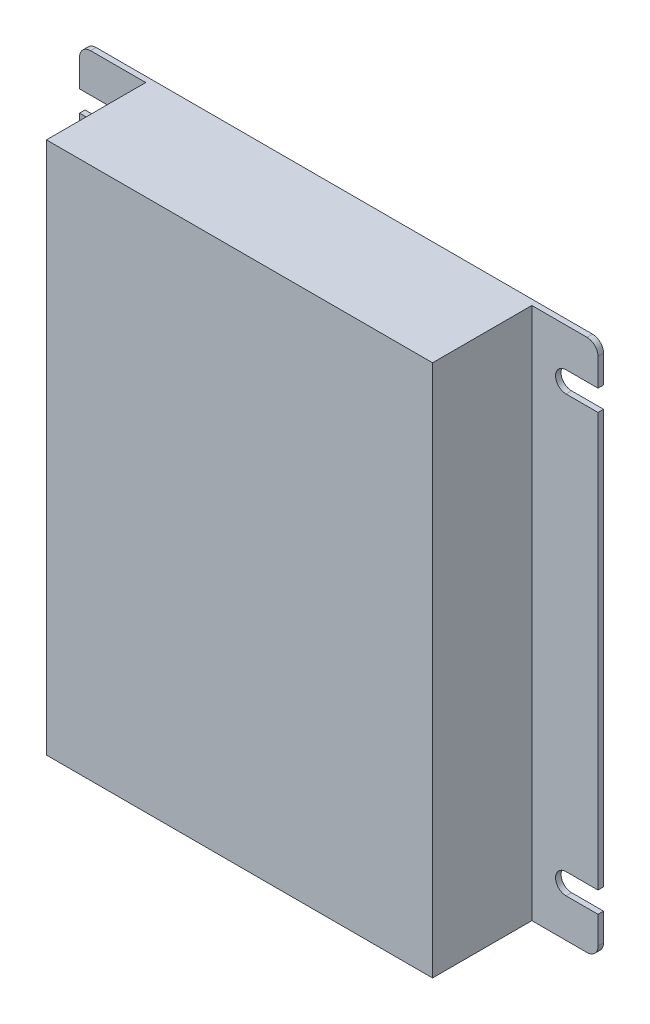
ISO-10303-21;
HEADER;
FILE_DESCRIPTION(('STEP AP214'),'2;1');
FILE_NAME('part.step','',(''),(''),'','','');
FILE_SCHEMA(('AUTOMOTIVE_DESIGN { 1 0 10303 214 1 1 1 1 }'));
ENDSEC;
DATA;
#1=APPLICATION_CONTEXT('core data for automotive mechanical design processes');
#2=APPLICATION_PROTOCOL_DEFINITION('international standard','automotive_design',2000,#1);
#3=PRODUCT_CONTEXT('',#1,'mechanical');
#4=PRODUCT('Part','Part','',(#3));
#5=PRODUCT_RELATED_PRODUCT_CATEGORY('part','',(#4));
#6=PRODUCT_DEFINITION_FORMATION('','',#4);
#7=PRODUCT_DEFINITION_CONTEXT('part definition',#1,'design');
#8=PRODUCT_DEFINITION('design','',#6,#7);
#9=PRODUCT_DEFINITION_SHAPE('','',#8);
#10=(LENGTH_UNIT() NAMED_UNIT(*) SI_UNIT(.MILLI.,.METRE.));
#11=(NAMED_UNIT(*) PLANE_ANGLE_UNIT() SI_UNIT($,.RADIAN.));
#12=(NAMED_UNIT(*) SI_UNIT($,.STERADIAN.) SOLID_ANGLE_UNIT());
#13=UNCERTAINTY_MEASURE_WITH_UNIT(LENGTH_MEASURE(1.E-05),#10,'distance_accuracy_value','');
#14=(GEOMETRIC_REPRESENTATION_CONTEXT(3) GLOBAL_UNCERTAINTY_ASSIGNED_CONTEXT((#13)) GLOBAL_UNIT_ASSIGNED_CONTEXT((#10,
#11,#12)) REPRESENTATION_CONTEXT('',''));
#15=CARTESIAN_POINT('',(0.,0.,0.));
#16=DIRECTION('',(0.,0.,1.));
#17=DIRECTION('',(1.,0.,0.));
#18=AXIS2_PLACEMENT_3D('',#15,#16,#17);
#19=CARTESIAN_POINT('',(59.69,61.341,24.13));
#20=DIRECTION('',(-1.,0.,0.));
#21=DIRECTION('',(0.,-1.,0.));
#22=AXIS2_PLACEMENT_3D('',#19,#20,#21);
#23=PLANE('',#22);
#24=DIRECTION('',(0.,1.,0.));
#25=VECTOR('',#24,1.);
#26=CARTESIAN_POINT('',(59.69,61.341,0.));
#27=LINE('',#26,#25);
#28=CARTESIAN_POINT('',(59.69,-47.625,0.));
#29=VERTEX_POINT('',#28);
#30=CARTESIAN_POINT('',(59.69,47.625,0.));
#31=VERTEX_POINT('',#30);
#32=EDGE_CURVE('E321',#29,#31,#27,.T.);
#33=ORIENTED_EDGE('',*,*,#32,.T.);
#34=DIRECTION('',(0.,0.,1.));
#35=VECTOR('',#34,1.);
#36=CARTESIAN_POINT('',(59.69,47.625,0.));
#37=LINE('',#36,#35);
#38=CARTESIAN_POINT('',(59.69,47.625,1.26999999999999));
#39=VERTEX_POINT('',#38);
#40=EDGE_CURVE('E361',#31,#39,#37,.T.);
#41=ORIENTED_EDGE('',*,*,#40,.T.);
#42=DIRECTION('',(0.,-1.,0.));
#43=VECTOR('',#42,1.);
#44=CARTESIAN_POINT('',(59.69,61.341,1.27));
#45=LINE('',#44,#43);
#46=CARTESIAN_POINT('',(59.69,-47.625,1.27));
#47=VERTEX_POINT('',#46);
#48=EDGE_CURVE('E324',#39,#47,#45,.T.);
#49=ORIENTED_EDGE('',*,*,#48,.T.);
#50=DIRECTION('',(0.,0.,1.));
#51=VECTOR('',#50,1.);
#52=CARTESIAN_POINT('',(59.69,-47.625,0.));
#53=LINE('',#52,#51);
#54=EDGE_CURVE('E349',#29,#47,#53,.T.);
#55=ORIENTED_EDGE('',*,*,#54,.F.);
#56=EDGE_LOOP('',(#33,#41,#49,#55));
#57=FACE_BOUND('',#56,.T.);
#58=ADVANCED_FACE('F34',(#57),#23,.F.);
#59=CARTESIAN_POINT('',(59.69,-52.451,1.26999999999999));
#60=VERTEX_POINT('',#59);
#61=CARTESIAN_POINT('',(59.69,-58.801,1.27));
#62=VERTEX_POINT('',#61);
#63=EDGE_CURVE('E326',#60,#62,#45,.T.);
#64=ORIENTED_EDGE('',*,*,#63,.T.);
#65=DIRECTION('',(0.,0.,-1.));
#66=VECTOR('',#65,1.);
#67=CARTESIAN_POINT('',(59.69,-58.801,24.13));
#68=LINE('',#67,#66);
#69=CARTESIAN_POINT('',(59.69,-58.801,0.));
#70=VERTEX_POINT('',#69);
#71=EDGE_CURVE('E293',#62,#70,#68,.T.);
#72=ORIENTED_EDGE('',*,*,#71,.T.);
#73=CARTESIAN_POINT('',(59.69,-52.451,0.));
#74=VERTEX_POINT('',#73);
#75=EDGE_CURVE('E252',#70,#74,#27,.T.);
#76=ORIENTED_EDGE('',*,*,#75,.T.);
#77=DIRECTION('',(0.,0.,1.));
#78=VECTOR('',#77,1.);
#79=CARTESIAN_POINT('',(59.69,-52.451,0.));
#80=LINE('',#79,#78);
#81=EDGE_CURVE('E333',#74,#60,#80,.T.);
#82=ORIENTED_EDGE('',*,*,#81,.T.);
#83=EDGE_LOOP('',(#64,#72,#76,#82));
#84=FACE_BOUND('',#83,.T.);
#85=ADVANCED_FACE('F332',(#84),#23,.F.);
#86=CARTESIAN_POINT('',(-59.69,61.341,24.13));
#87=DIRECTION('',(1.,0.,0.));
#88=DIRECTION('',(0.,1.,0.));
#89=AXIS2_PLACEMENT_3D('',#86,#87,#88);
#90=PLANE('',#89);
#91=DIRECTION('',(0.,-1.,0.));
#92=VECTOR('',#91,1.);
#93=CARTESIAN_POINT('',(-59.69,61.341,0.));
#94=LINE('',#93,#92);
#95=CARTESIAN_POINT('',(-59.69,47.625,0.));
#96=VERTEX_POINT('',#95);
#97=CARTESIAN_POINT('',(-59.69,-47.625,0.));
#98=VERTEX_POINT('',#97);
#99=EDGE_CURVE('E246',#96,#98,#94,.T.);
#100=ORIENTED_EDGE('',*,*,#99,.T.);
#101=DIRECTION('',(0.,0.,1.));
#102=VECTOR('',#101,1.);
#103=CARTESIAN_POINT('',(-59.69,-47.625,0.));
#104=LINE('',#103,#102);
#105=CARTESIAN_POINT('',(-59.69,-47.625,1.26999999999999));
#106=VERTEX_POINT('',#105);
#107=EDGE_CURVE('E405',#98,#106,#104,.T.);
#108=ORIENTED_EDGE('',*,*,#107,.T.);
#109=DIRECTION('',(0.,-1.,0.));
#110=VECTOR('',#109,1.);
#111=CARTESIAN_POINT('',(-59.69,61.341,1.26999999999999));
#112=LINE('',#111,#110);
#113=CARTESIAN_POINT('',(-59.69,47.625,1.26999999999999));
#114=VERTEX_POINT('',#113);
#115=EDGE_CURVE('E442',#114,#106,#112,.T.);
#116=ORIENTED_EDGE('',*,*,#115,.F.);
#117=DIRECTION('',(0.,0.,1.));
#118=VECTOR('',#117,1.);
#119=CARTESIAN_POINT('',(-59.69,47.625,0.));
#120=LINE('',#119,#118);
#121=EDGE_CURVE('E400',#96,#114,#120,.T.);
#122=ORIENTED_EDGE('',*,*,#121,.F.);
#123=EDGE_LOOP('',(#100,#108,#116,#122));
#124=FACE_BOUND('',#123,.T.);
#125=ADVANCED_FACE('F472',(#124),#90,.F.);
#126=CARTESIAN_POINT('',(-59.69,58.801,1.26999999999999));
#127=VERTEX_POINT('',#126);
#128=CARTESIAN_POINT('',(-59.69,52.451,1.26999999999999));
#129=VERTEX_POINT('',#128);
#130=EDGE_CURVE('E441',#127,#129,#112,.T.);
#131=ORIENTED_EDGE('',*,*,#130,.F.);
#132=DIRECTION('',(0.,0.,-1.));
#133=VECTOR('',#132,1.);
#134=CARTESIAN_POINT('',(-59.69,58.801,24.13));
#135=LINE('',#134,#133);
#136=CARTESIAN_POINT('',(-59.69,58.801,0.));
#137=VERTEX_POINT('',#136);
#138=EDGE_CURVE('E269',#127,#137,#135,.T.);
#139=ORIENTED_EDGE('',*,*,#138,.T.);
#140=CARTESIAN_POINT('',(-59.69,52.451,0.));
#141=VERTEX_POINT('',#140);
#142=EDGE_CURVE('E249',#137,#141,#94,.T.);
#143=ORIENTED_EDGE('',*,*,#142,.T.);
#144=DIRECTION('',(0.,0.,1.));
#145=VECTOR('',#144,1.);
#146=CARTESIAN_POINT('',(-59.69,52.451,0.));
#147=LINE('',#146,#145);
#148=EDGE_CURVE('E410',#141,#129,#147,.T.);
#149=ORIENTED_EDGE('',*,*,#148,.T.);
#150=EDGE_LOOP('',(#131,#139,#143,#149));
#151=FACE_BOUND('',#150,.T.);
#152=ADVANCED_FACE('F476',(#151),#90,.F.);
#153=CARTESIAN_POINT('',(59.69,52.451,0.));
#154=VERTEX_POINT('',#153);
#155=CARTESIAN_POINT('',(59.69,58.801,0.));
#156=VERTEX_POINT('',#155);
#157=EDGE_CURVE('E316',#154,#156,#27,.T.);
#158=ORIENTED_EDGE('',*,*,#157,.T.);
#159=DIRECTION('',(0.,0.,-1.));
#160=VECTOR('',#159,1.);
#161=CARTESIAN_POINT('',(59.69,58.801,24.13));
#162=LINE('',#161,#160);
#163=CARTESIAN_POINT('',(59.69,58.801,1.27));
#164=VERTEX_POINT('',#163);
#165=EDGE_CURVE('E11',#156,#164,#162,.F.);
#166=ORIENTED_EDGE('',*,*,#165,.T.);
#167=CARTESIAN_POINT('',(59.69,52.451,1.27));
#168=VERTEX_POINT('',#167);
#169=EDGE_CURVE('E304',#164,#168,#45,.T.);
#170=ORIENTED_EDGE('',*,*,#169,.T.);
#171=DIRECTION('',(0.,0.,1.));
#172=VECTOR('',#171,1.);
#173=CARTESIAN_POINT('',(59.69,52.451,0.));
#174=LINE('',#173,#172);
#175=EDGE_CURVE('E320',#154,#168,#174,.T.);
#176=ORIENTED_EDGE('',*,*,#175,.F.);
#177=EDGE_LOOP('',(#158,#166,#170,#176));
#178=FACE_BOUND('',#177,.T.);
#179=ADVANCED_FACE('F318',(#178),#23,.F.);
#180=CARTESIAN_POINT('',(-59.69,61.341,24.13));
#181=DIRECTION('',(0.,-1.,0.));
#182=DIRECTION('',(0.,0.,-1.));
#183=AXIS2_PLACEMENT_3D('',#180,#181,#182);
#184=PLANE('',#183);
#185=DIRECTION('',(-1.,0.,0.));
#186=VECTOR('',#185,1.);
#187=CARTESIAN_POINT('',(-59.69,61.341,0.));
#188=LINE('',#187,#186);
#189=CARTESIAN_POINT('',(57.15,61.341,0.));
#190=VERTEX_POINT('',#189);
#191=CARTESIAN_POINT('',(-57.15,61.341,0.));
#192=VERTEX_POINT('',#191);
#193=EDGE_CURVE('E247',#190,#192,#188,.T.);
#194=ORIENTED_EDGE('',*,*,#193,.T.);
#195=DIRECTION('',(0.,0.,-1.));
#196=VECTOR('',#195,1.);
#197=CARTESIAN_POINT('',(-57.15,61.341,24.13));
#198=LINE('',#197,#196);
#199=CARTESIAN_POINT('',(-57.15,61.341,1.26999999999999));
#200=VERTEX_POINT('',#199);
#201=EDGE_CURVE('E281',#192,#200,#198,.F.);
#202=ORIENTED_EDGE('',*,*,#201,.T.);
#203=DIRECTION('',(1.,0.,0.));
#204=VECTOR('',#203,1.);
#205=CARTESIAN_POINT('',(-59.69,61.341,1.26999999999999));
#206=LINE('',#205,#204);
#207=CARTESIAN_POINT('',(-44.45,61.341,1.26999999999999));
#208=VERTEX_POINT('',#207);
#209=EDGE_CURVE('E428',#200,#208,#206,.T.);
#210=ORIENTED_EDGE('',*,*,#209,.T.);
#211=DIRECTION('',(0.,0.,1.));
#212=VECTOR('',#211,1.);
#213=CARTESIAN_POINT('',(-44.45,61.341,24.13));
#214=LINE('',#213,#212);
#215=CARTESIAN_POINT('',(-44.45,61.341,24.13));
#216=VERTEX_POINT('',#215);
#217=EDGE_CURVE('E430',#208,#216,#214,.T.);
#218=ORIENTED_EDGE('',*,*,#217,.T.);
#219=DIRECTION('',(-1.,0.,0.));
#220=VECTOR('',#219,1.);
#221=CARTESIAN_POINT('',(-59.69,61.341,24.13));
#222=LINE('',#221,#220);
#223=CARTESIAN_POINT('',(44.45,61.341,24.13));
#224=VERTEX_POINT('',#223);
#225=EDGE_CURVE('E261',#224,#216,#222,.T.);
#226=ORIENTED_EDGE('',*,*,#225,.F.);
#227=DIRECTION('',(0.,0.,-1.));
#228=VECTOR('',#227,1.);
#229=CARTESIAN_POINT('',(44.45,61.341,24.13));
#230=LINE('',#229,#228);
#231=CARTESIAN_POINT('',(44.45,61.341,1.27));
#232=VERTEX_POINT('',#231);
#233=EDGE_CURVE('E311',#224,#232,#230,.T.);
#234=ORIENTED_EDGE('',*,*,#233,.T.);
#235=DIRECTION('',(1.,0.,0.));
#236=VECTOR('',#235,1.);
#237=CARTESIAN_POINT('',(59.69,61.341,1.27));
#238=LINE('',#237,#236);
#239=CARTESIAN_POINT('',(57.15,61.341,1.27));
#240=VERTEX_POINT('',#239);
#241=EDGE_CURVE('E301',#232,#240,#238,.T.);
#242=ORIENTED_EDGE('',*,*,#241,.T.);
#243=DIRECTION('',(0.,0.,-1.));
#244=VECTOR('',#243,1.);
#245=CARTESIAN_POINT('',(57.15,61.341,24.13));
#246=LINE('',#245,#244);
#247=EDGE_CURVE('E278',#240,#190,#246,.T.);
#248=ORIENTED_EDGE('',*,*,#247,.T.);
#249=EDGE_LOOP('',(#194,#202,#210,#218,#226,#234,#242,#248));
#250=FACE_BOUND('',#249,.T.);
#251=ADVANCED_FACE('F308',(#250),#184,.F.);
#252=CARTESIAN_POINT('',(-59.69,-52.451,0.));
#253=VERTEX_POINT('',#252);
#254=CARTESIAN_POINT('',(-59.69,-58.801,0.));
#255=VERTEX_POINT('',#254);
#256=EDGE_CURVE('E236',#253,#255,#94,.T.);
#257=ORIENTED_EDGE('',*,*,#256,.T.);
#258=DIRECTION('',(0.,0.,-1.));
#259=VECTOR('',#258,1.);
#260=CARTESIAN_POINT('',(-59.69,-58.801,24.13));
#261=LINE('',#260,#259);
#262=CARTESIAN_POINT('',(-59.69,-58.801,1.26999999999999));
#263=VERTEX_POINT('',#262);
#264=EDGE_CURVE('E291',#255,#263,#261,.F.);
#265=ORIENTED_EDGE('',*,*,#264,.T.);
#266=CARTESIAN_POINT('',(-59.69,-52.451,1.26999999999999));
#267=VERTEX_POINT('',#266);
#268=EDGE_CURVE('E239',#267,#263,#112,.T.);
#269=ORIENTED_EDGE('',*,*,#268,.F.);
#270=DIRECTION('',(0.,0.,1.));
#271=VECTOR('',#270,1.);
#272=CARTESIAN_POINT('',(-59.69,-52.451,0.));
#273=LINE('',#272,#271);
#274=EDGE_CURVE('E222',#253,#267,#273,.T.);
#275=ORIENTED_EDGE('',*,*,#274,.F.);
#276=EDGE_LOOP('',(#257,#265,#269,#275));
#277=FACE_BOUND('',#276,.T.);
#278=ADVANCED_FACE('F235',(#277),#90,.F.);
#279=CARTESIAN_POINT('',(-59.69,-61.341,24.13));
#280=DIRECTION('',(0.,1.,0.));
#281=DIRECTION('',(0.,0.,1.));
#282=AXIS2_PLACEMENT_3D('',#279,#280,#281);
#283=PLANE('',#282);
#284=DIRECTION('',(1.,0.,0.));
#285=VECTOR('',#284,1.);
#286=CARTESIAN_POINT('',(-59.69,-61.341,1.26999999999999));
#287=LINE('',#286,#285);
#288=CARTESIAN_POINT('',(-57.15,-61.341,1.26999999999999));
#289=VERTEX_POINT('',#288);
#290=CARTESIAN_POINT('',(-44.45,-61.341,1.26999999999999));
#291=VERTEX_POINT('',#290);
#292=EDGE_CURVE('E412',#289,#291,#287,.T.);
#293=ORIENTED_EDGE('',*,*,#292,.F.);
#294=DIRECTION('',(0.,0.,-1.));
#295=VECTOR('',#294,1.);
#296=CARTESIAN_POINT('',(-57.15,-61.341,24.13));
#297=LINE('',#296,#295);
#298=CARTESIAN_POINT('',(-57.15,-61.341,0.));
#299=VERTEX_POINT('',#298);
#300=EDGE_CURVE('E289',#289,#299,#297,.T.);
#301=ORIENTED_EDGE('',*,*,#300,.T.);
#302=DIRECTION('',(1.,0.,0.));
#303=VECTOR('',#302,1.);
#304=CARTESIAN_POINT('',(-59.69,-61.341,0.));
#305=LINE('',#304,#303);
#306=CARTESIAN_POINT('',(57.15,-61.341,0.));
#307=VERTEX_POINT('',#306);
#308=EDGE_CURVE('E255',#299,#307,#305,.T.);
#309=ORIENTED_EDGE('',*,*,#308,.T.);
#310=DIRECTION('',(0.,0.,-1.));
#311=VECTOR('',#310,1.);
#312=CARTESIAN_POINT('',(57.15,-61.341,24.13));
#313=LINE('',#312,#311);
#314=CARTESIAN_POINT('',(57.15,-61.341,1.27));
#315=VERTEX_POINT('',#314);
#316=EDGE_CURVE('E287',#307,#315,#313,.F.);
#317=ORIENTED_EDGE('',*,*,#316,.T.);
#318=DIRECTION('',(1.,0.,0.));
#319=VECTOR('',#318,1.);
#320=CARTESIAN_POINT('',(59.69,-61.341,1.27));
#321=LINE('',#320,#319);
#322=CARTESIAN_POINT('',(44.45,-61.341,1.27));
#323=VERTEX_POINT('',#322);
#324=EDGE_CURVE('E418',#323,#315,#321,.T.);
#325=ORIENTED_EDGE('',*,*,#324,.F.);
#326=DIRECTION('',(0.,0.,-1.));
#327=VECTOR('',#326,1.);
#328=CARTESIAN_POINT('',(44.45,-61.341,24.13));
#329=LINE('',#328,#327);
#330=CARTESIAN_POINT('',(44.45,-61.341,24.13));
#331=VERTEX_POINT('',#330);
#332=EDGE_CURVE('E420',#331,#323,#329,.T.);
#333=ORIENTED_EDGE('',*,*,#332,.F.);
#334=DIRECTION('',(1.,0.,0.));
#335=VECTOR('',#334,1.);
#336=CARTESIAN_POINT('',(-59.69,-61.341,24.13));
#337=LINE('',#336,#335);
#338=CARTESIAN_POINT('',(-44.45,-61.341,24.13));
#339=VERTEX_POINT('',#338);
#340=EDGE_CURVE('E266',#339,#331,#337,.T.);
#341=ORIENTED_EDGE('',*,*,#340,.F.);
#342=DIRECTION('',(0.,0.,1.));
#343=VECTOR('',#342,1.);
#344=CARTESIAN_POINT('',(-44.45,-61.341,24.13));
#345=LINE('',#344,#343);
#346=EDGE_CURVE('E431',#291,#339,#345,.T.);
#347=ORIENTED_EDGE('',*,*,#346,.F.);
#348=EDGE_LOOP('',(#293,#301,#309,#317,#325,#333,#341,#347));
#349=FACE_BOUND('',#348,.T.);
#350=ADVANCED_FACE('F451',(#349),#283,.F.);
#351=CARTESIAN_POINT('',(0.,0.,24.13));
#352=DIRECTION('',(0.,0.,1.));
#353=DIRECTION('',(1.,0.,0.));
#354=AXIS2_PLACEMENT_3D('',#351,#352,#353);
#355=PLANE('',#354);
#356=DIRECTION('',(0.,-1.,0.));
#357=VECTOR('',#356,1.);
#358=CARTESIAN_POINT('',(44.45,61.341,24.13));
#359=LINE('',#358,#357);
#360=EDGE_CURVE('E312',#224,#331,#359,.T.);
#361=ORIENTED_EDGE('',*,*,#360,.F.);
#362=ORIENTED_EDGE('',*,*,#225,.T.);
#363=DIRECTION('',(0.,-1.,0.));
#364=VECTOR('',#363,1.);
#365=CARTESIAN_POINT('',(-44.45,61.341,24.13));
#366=LINE('',#365,#364);
#367=EDGE_CURVE('E423',#216,#339,#366,.T.);
#368=ORIENTED_EDGE('',*,*,#367,.T.);
#369=ORIENTED_EDGE('',*,*,#340,.T.);
#370=EDGE_LOOP('',(#361,#362,#368,#369));
#371=FACE_BOUND('',#370,.T.);
#372=ADVANCED_FACE('F447',(#371),#355,.T.);
#373=CARTESIAN_POINT('',(0.,0.,0.));
#374=DIRECTION('',(0.,0.,1.));
#375=DIRECTION('',(1.,0.,0.));
#376=AXIS2_PLACEMENT_3D('',#373,#374,#375);
#377=PLANE('',#376);
#378=ORIENTED_EDGE('',*,*,#142,.F.);
#379=CARTESIAN_POINT('',(-57.15,58.801,0.));
#380=DIRECTION('',(0.,0.,1.));
#381=DIRECTION('',(1.,0.,0.));
#382=AXIS2_PLACEMENT_3D('',#379,#380,#381);
#383=CIRCLE('',#382,2.54);
#384=EDGE_CURVE('E276',#137,#192,#383,.F.);
#385=ORIENTED_EDGE('',*,*,#384,.T.);
#386=ORIENTED_EDGE('',*,*,#193,.F.);
#387=CARTESIAN_POINT('',(57.15,58.801,0.));
#388=DIRECTION('',(0.,0.,1.));
#389=DIRECTION('',(1.,0.,0.));
#390=AXIS2_PLACEMENT_3D('',#387,#388,#389);
#391=CIRCLE('',#390,2.54);
#392=EDGE_CURVE('E271',#190,#156,#391,.F.);
#393=ORIENTED_EDGE('',*,*,#392,.T.);
#394=ORIENTED_EDGE('',*,*,#157,.F.);
#395=DIRECTION('',(-1.,0.,0.));
#396=VECTOR('',#395,1.);
#397=CARTESIAN_POINT('',(59.69,52.451,0.));
#398=LINE('',#397,#396);
#399=CARTESIAN_POINT('',(52.324,52.451,0.));
#400=VERTEX_POINT('',#399);
#401=EDGE_CURVE('E367',#154,#400,#398,.T.);
#402=ORIENTED_EDGE('',*,*,#401,.T.);
#403=CARTESIAN_POINT('',(52.324,50.038,0.));
#404=DIRECTION('',(0.,0.,1.));
#405=DIRECTION('',(1.,0.,0.));
#406=AXIS2_PLACEMENT_3D('',#403,#404,#405);
#407=CIRCLE('',#406,2.413);
#408=CARTESIAN_POINT('',(52.324,47.625,0.));
#409=VERTEX_POINT('',#408);
#410=EDGE_CURVE('E369',#400,#409,#407,.T.);
#411=ORIENTED_EDGE('',*,*,#410,.T.);
#412=DIRECTION('',(1.,0.,0.));
#413=VECTOR('',#412,1.);
#414=CARTESIAN_POINT('',(59.69,47.625,0.));
#415=LINE('',#414,#413);
#416=EDGE_CURVE('E373',#409,#31,#415,.T.);
#417=ORIENTED_EDGE('',*,*,#416,.T.);
#418=ORIENTED_EDGE('',*,*,#32,.F.);
#419=DIRECTION('',(-1.,0.,0.));
#420=VECTOR('',#419,1.);
#421=CARTESIAN_POINT('',(59.69,-47.625,0.));
#422=LINE('',#421,#420);
#423=CARTESIAN_POINT('',(52.324,-47.625,0.));
#424=VERTEX_POINT('',#423);
#425=EDGE_CURVE('E353',#29,#424,#422,.T.);
#426=ORIENTED_EDGE('',*,*,#425,.T.);
#427=CARTESIAN_POINT('',(52.324,-50.038,0.));
#428=DIRECTION('',(0.,0.,1.));
#429=DIRECTION('',(1.,0.,0.));
#430=AXIS2_PLACEMENT_3D('',#427,#428,#429);
#431=CIRCLE('',#430,2.413);
#432=CARTESIAN_POINT('',(52.324,-52.451,0.));
#433=VERTEX_POINT('',#432);
#434=EDGE_CURVE('E348',#424,#433,#431,.T.);
#435=ORIENTED_EDGE('',*,*,#434,.T.);
#436=DIRECTION('',(1.,0.,0.));
#437=VECTOR('',#436,1.);
#438=CARTESIAN_POINT('',(59.69,-52.451,0.));
#439=LINE('',#438,#437);
#440=EDGE_CURVE('E339',#433,#74,#439,.T.);
#441=ORIENTED_EDGE('',*,*,#440,.T.);
#442=ORIENTED_EDGE('',*,*,#75,.F.);
#443=CARTESIAN_POINT('',(57.15,-58.801,0.));
#444=DIRECTION('',(0.,0.,1.));
#445=DIRECTION('',(1.,0.,0.));
#446=AXIS2_PLACEMENT_3D('',#443,#444,#445);
#447=CIRCLE('',#446,2.54);
#448=EDGE_CURVE('E273',#70,#307,#447,.F.);
#449=ORIENTED_EDGE('',*,*,#448,.T.);
#450=ORIENTED_EDGE('',*,*,#308,.F.);
#451=CARTESIAN_POINT('',(-57.15,-58.801,0.));
#452=DIRECTION('',(0.,0.,1.));
#453=DIRECTION('',(1.,0.,0.));
#454=AXIS2_PLACEMENT_3D('',#451,#452,#453);
#455=CIRCLE('',#454,2.54);
#456=EDGE_CURVE('E245',#299,#255,#455,.F.);
#457=ORIENTED_EDGE('',*,*,#456,.T.);
#458=ORIENTED_EDGE('',*,*,#256,.F.);
#459=DIRECTION('',(1.,0.,0.));
#460=VECTOR('',#459,1.);
#461=CARTESIAN_POINT('',(-59.69,-52.451,0.));
#462=LINE('',#461,#460);
#463=CARTESIAN_POINT('',(-52.324,-52.451,0.));
#464=VERTEX_POINT('',#463);
#465=EDGE_CURVE('E218',#253,#464,#462,.T.);
#466=ORIENTED_EDGE('',*,*,#465,.T.);
#467=CARTESIAN_POINT('',(-52.324,-50.038,0.));
#468=DIRECTION('',(0.,0.,1.));
#469=DIRECTION('',(1.,0.,0.));
#470=AXIS2_PLACEMENT_3D('',#467,#468,#469);
#471=CIRCLE('',#470,2.41299999999999);
#472=CARTESIAN_POINT('',(-52.324,-47.625,0.));
#473=VERTEX_POINT('',#472);
#474=EDGE_CURVE('E229',#464,#473,#471,.T.);
#475=ORIENTED_EDGE('',*,*,#474,.T.);
#476=DIRECTION('',(-1.,0.,0.));
#477=VECTOR('',#476,1.);
#478=CARTESIAN_POINT('',(-59.69,-47.625,0.));
#479=LINE('',#478,#477);
#480=EDGE_CURVE('E240',#473,#98,#479,.T.);
#481=ORIENTED_EDGE('',*,*,#480,.T.);
#482=ORIENTED_EDGE('',*,*,#99,.F.);
#483=DIRECTION('',(1.,0.,0.));
#484=VECTOR('',#483,1.);
#485=CARTESIAN_POINT('',(-59.69,47.625,0.));
#486=LINE('',#485,#484);
#487=CARTESIAN_POINT('',(-52.324,47.625,0.));
#488=VERTEX_POINT('',#487);
#489=EDGE_CURVE('E390',#96,#488,#486,.T.);
#490=ORIENTED_EDGE('',*,*,#489,.T.);
#491=CARTESIAN_POINT('',(-52.324,50.038,0.));
#492=DIRECTION('',(0.,0.,1.));
#493=DIRECTION('',(1.,0.,0.));
#494=AXIS2_PLACEMENT_3D('',#491,#492,#493);
#495=CIRCLE('',#494,2.413);
#496=CARTESIAN_POINT('',(-52.324,52.451,0.));
#497=VERTEX_POINT('',#496);
#498=EDGE_CURVE('E393',#488,#497,#495,.T.);
#499=ORIENTED_EDGE('',*,*,#498,.T.);
#500=DIRECTION('',(-1.,0.,0.));
#501=VECTOR('',#500,1.);
#502=CARTESIAN_POINT('',(-59.69,52.451,0.));
#503=LINE('',#502,#501);
#504=EDGE_CURVE('E397',#497,#141,#503,.T.);
#505=ORIENTED_EDGE('',*,*,#504,.T.);
#506=EDGE_LOOP('',(#378,#385,#386,#393,#394,#402,#411,#417,#418,#426,#435,#441,#442,#449,#450,
#457,#458,#466,#475,#481,#482,#490,#499,#505));
#507=FACE_BOUND('',#506,.T.);
#508=ADVANCED_FACE('F243',(#507),#377,.F.);
#509=CARTESIAN_POINT('',(-44.45,61.341,24.13));
#510=DIRECTION('',(1.,0.,0.));
#511=DIRECTION('',(0.,0.,-1.));
#512=AXIS2_PLACEMENT_3D('',#509,#510,#511);
#513=PLANE('',#512);
#514=ORIENTED_EDGE('',*,*,#346,.T.);
#515=ORIENTED_EDGE('',*,*,#367,.F.);
#516=ORIENTED_EDGE('',*,*,#217,.F.);
#517=DIRECTION('',(0.,-1.,0.));
#518=VECTOR('',#517,1.);
#519=CARTESIAN_POINT('',(-44.45,61.341,1.26999999999999));
#520=LINE('',#519,#518);
#521=EDGE_CURVE('E438',#208,#291,#520,.T.);
#522=ORIENTED_EDGE('',*,*,#521,.T.);
#523=EDGE_LOOP('',(#514,#515,#516,#522));
#524=FACE_BOUND('',#523,.T.);
#525=ADVANCED_FACE('F498',(#524),#513,.F.);
#526=CARTESIAN_POINT('',(-59.69,61.341,1.26999999999999));
#527=DIRECTION('',(0.,0.,-1.));
#528=DIRECTION('',(-1.,0.,0.));
#529=AXIS2_PLACEMENT_3D('',#526,#527,#528);
#530=PLANE('',#529);
#531=ORIENTED_EDGE('',*,*,#209,.F.);
#532=CARTESIAN_POINT('',(-57.15,58.801,1.26999999999999));
#533=DIRECTION('',(0.,0.,-1.));
#534=DIRECTION('',(-1.,0.,0.));
#535=AXIS2_PLACEMENT_3D('',#532,#533,#534);
#536=CIRCLE('',#535,2.54);
#537=EDGE_CURVE('E285',#200,#127,#536,.F.);
#538=ORIENTED_EDGE('',*,*,#537,.T.);
#539=ORIENTED_EDGE('',*,*,#130,.T.);
#540=DIRECTION('',(-1.,0.,0.));
#541=VECTOR('',#540,1.);
#542=CARTESIAN_POINT('',(-59.69,52.451,1.26999999999999));
#543=LINE('',#542,#541);
#544=CARTESIAN_POINT('',(-52.324,52.451,1.26999999999999));
#545=VERTEX_POINT('',#544);
#546=EDGE_CURVE('E394',#545,#129,#543,.T.);
#547=ORIENTED_EDGE('',*,*,#546,.F.);
#548=CARTESIAN_POINT('',(-52.324,50.038,1.26999999999999));
#549=DIRECTION('',(0.,0.,1.));
#550=DIRECTION('',(1.,0.,0.));
#551=AXIS2_PLACEMENT_3D('',#548,#549,#550);
#552=CIRCLE('',#551,2.413);
#553=CARTESIAN_POINT('',(-52.324,47.625,1.26999999999999));
#554=VERTEX_POINT('',#553);
#555=EDGE_CURVE('E404',#554,#545,#552,.T.);
#556=ORIENTED_EDGE('',*,*,#555,.F.);
#557=DIRECTION('',(1.,0.,0.));
#558=VECTOR('',#557,1.);
#559=CARTESIAN_POINT('',(-59.69,47.625,1.26999999999999));
#560=LINE('',#559,#558);
#561=EDGE_CURVE('E401',#114,#554,#560,.T.);
#562=ORIENTED_EDGE('',*,*,#561,.F.);
#563=ORIENTED_EDGE('',*,*,#115,.T.);
#564=DIRECTION('',(-1.,0.,0.));
#565=VECTOR('',#564,1.);
#566=CARTESIAN_POINT('',(-59.69,-47.625,1.26999999999999));
#567=LINE('',#566,#565);
#568=CARTESIAN_POINT('',(-52.324,-47.625,1.26999999999999));
#569=VERTEX_POINT('',#568);
#570=EDGE_CURVE('E230',#569,#106,#567,.T.);
#571=ORIENTED_EDGE('',*,*,#570,.F.);
#572=CARTESIAN_POINT('',(-52.324,-50.038,1.26999999999999));
#573=DIRECTION('',(0.,0.,1.));
#574=DIRECTION('',(1.,0.,0.));
#575=AXIS2_PLACEMENT_3D('',#572,#573,#574);
#576=CIRCLE('',#575,2.41299999999999);
#577=CARTESIAN_POINT('',(-52.324,-52.451,1.26999999999999));
#578=VERTEX_POINT('',#577);
#579=EDGE_CURVE('E564',#578,#569,#576,.T.);
#580=ORIENTED_EDGE('',*,*,#579,.F.);
#581=DIRECTION('',(1.,0.,0.));
#582=VECTOR('',#581,1.);
#583=CARTESIAN_POINT('',(-59.69,-52.451,1.26999999999999));
#584=LINE('',#583,#582);
#585=EDGE_CURVE('E343',#267,#578,#584,.T.);
#586=ORIENTED_EDGE('',*,*,#585,.F.);
#587=ORIENTED_EDGE('',*,*,#268,.T.);
#588=CARTESIAN_POINT('',(-57.15,-58.801,1.26999999999999));
#589=DIRECTION('',(0.,0.,-1.));
#590=DIRECTION('',(-1.,0.,0.));
#591=AXIS2_PLACEMENT_3D('',#588,#589,#590);
#592=CIRCLE('',#591,2.54);
#593=EDGE_CURVE('E283',#263,#289,#592,.F.);
#594=ORIENTED_EDGE('',*,*,#593,.T.);
#595=ORIENTED_EDGE('',*,*,#292,.T.);
#596=ORIENTED_EDGE('',*,*,#521,.F.);
#597=EDGE_LOOP('',(#531,#538,#539,#547,#556,#562,#563,#571,#580,#586,#587,#594,#595,#596));
#598=FACE_BOUND('',#597,.T.);
#599=ADVANCED_FACE('F500',(#598),#530,.F.);
#600=CARTESIAN_POINT('',(59.69,61.341,1.27));
#601=DIRECTION('',(0.,0.,-1.));
#602=DIRECTION('',(-1.,0.,0.));
#603=AXIS2_PLACEMENT_3D('',#600,#601,#602);
#604=PLANE('',#603);
#605=ORIENTED_EDGE('',*,*,#324,.T.);
#606=CARTESIAN_POINT('',(57.15,-58.801,1.27));
#607=DIRECTION('',(0.,0.,-1.));
#608=DIRECTION('',(-1.,0.,0.));
#609=AXIS2_PLACEMENT_3D('',#606,#607,#608);
#610=CIRCLE('',#609,2.54);
#611=EDGE_CURVE('E42',#315,#62,#610,.F.);
#612=ORIENTED_EDGE('',*,*,#611,.T.);
#613=ORIENTED_EDGE('',*,*,#63,.F.);
#614=DIRECTION('',(1.,0.,0.));
#615=VECTOR('',#614,1.);
#616=CARTESIAN_POINT('',(59.69,-52.451,1.26999999999999));
#617=LINE('',#616,#615);
#618=CARTESIAN_POINT('',(52.324,-52.451,1.26999999999999));
#619=VERTEX_POINT('',#618);
#620=EDGE_CURVE('E342',#619,#60,#617,.T.);
#621=ORIENTED_EDGE('',*,*,#620,.F.);
#622=CARTESIAN_POINT('',(52.324,-50.038,1.26999999999999));
#623=DIRECTION('',(0.,0.,1.));
#624=DIRECTION('',(1.,0.,0.));
#625=AXIS2_PLACEMENT_3D('',#622,#623,#624);
#626=CIRCLE('',#625,2.413);
#627=CARTESIAN_POINT('',(52.324,-47.625,1.26999999999999));
#628=VERTEX_POINT('',#627);
#629=EDGE_CURVE('E360',#628,#619,#626,.T.);
#630=ORIENTED_EDGE('',*,*,#629,.F.);
#631=DIRECTION('',(-1.,0.,0.));
#632=VECTOR('',#631,1.);
#633=CARTESIAN_POINT('',(59.69,-47.625,1.26999999999999));
#634=LINE('',#633,#632);
#635=EDGE_CURVE('E357',#47,#628,#634,.T.);
#636=ORIENTED_EDGE('',*,*,#635,.F.);
#637=ORIENTED_EDGE('',*,*,#48,.F.);
#638=DIRECTION('',(1.,0.,0.));
#639=VECTOR('',#638,1.);
#640=CARTESIAN_POINT('',(59.69,47.625,1.26999999999999));
#641=LINE('',#640,#639);
#642=CARTESIAN_POINT('',(52.324,47.625,1.26999999999999));
#643=VERTEX_POINT('',#642);
#644=EDGE_CURVE('E370',#643,#39,#641,.T.);
#645=ORIENTED_EDGE('',*,*,#644,.F.);
#646=CARTESIAN_POINT('',(52.324,50.038,1.26999999999999));
#647=DIRECTION('',(0.,0.,1.));
#648=DIRECTION('',(1.,0.,0.));
#649=AXIS2_PLACEMENT_3D('',#646,#647,#648);
#650=CIRCLE('',#649,2.413);
#651=CARTESIAN_POINT('',(52.324,52.451,1.26999999999999));
#652=VERTEX_POINT('',#651);
#653=EDGE_CURVE('E379',#652,#643,#650,.T.);
#654=ORIENTED_EDGE('',*,*,#653,.F.);
#655=DIRECTION('',(-1.,0.,0.));
#656=VECTOR('',#655,1.);
#657=CARTESIAN_POINT('',(59.69,52.451,1.26999999999999));
#658=LINE('',#657,#656);
#659=EDGE_CURVE('E376',#168,#652,#658,.T.);
#660=ORIENTED_EDGE('',*,*,#659,.F.);
#661=ORIENTED_EDGE('',*,*,#169,.F.);
#662=CARTESIAN_POINT('',(57.15,58.801,1.27));
#663=DIRECTION('',(0.,0.,-1.));
#664=DIRECTION('',(-1.,0.,0.));
#665=AXIS2_PLACEMENT_3D('',#662,#663,#664);
#666=CIRCLE('',#665,2.54);
#667=EDGE_CURVE('E296',#164,#240,#666,.F.);
#668=ORIENTED_EDGE('',*,*,#667,.T.);
#669=ORIENTED_EDGE('',*,*,#241,.F.);
#670=DIRECTION('',(0.,-1.,0.));
#671=VECTOR('',#670,1.);
#672=CARTESIAN_POINT('',(44.45,61.341,1.27));
#673=LINE('',#672,#671);
#674=EDGE_CURVE('E425',#232,#323,#673,.T.);
#675=ORIENTED_EDGE('',*,*,#674,.T.);
#676=EDGE_LOOP('',(#605,#612,#613,#621,#630,#636,#637,#645,#654,#660,#661,#668,#669,#675));
#677=FACE_BOUND('',#676,.T.);
#678=ADVANCED_FACE('F300',(#677),#604,.F.);
#679=CARTESIAN_POINT('',(44.45,61.341,24.13));
#680=DIRECTION('',(-1.,0.,0.));
#681=DIRECTION('',(0.,0.,1.));
#682=AXIS2_PLACEMENT_3D('',#679,#680,#681);
#683=PLANE('',#682);
#684=ORIENTED_EDGE('',*,*,#332,.T.);
#685=ORIENTED_EDGE('',*,*,#674,.F.);
#686=ORIENTED_EDGE('',*,*,#233,.F.);
#687=ORIENTED_EDGE('',*,*,#360,.T.);
#688=EDGE_LOOP('',(#684,#685,#686,#687));
#689=FACE_BOUND('',#688,.T.);
#690=ADVANCED_FACE('F454',(#689),#683,.F.);
#691=CARTESIAN_POINT('',(59.69,-52.451,0.));
#692=DIRECTION('',(0.,-1.,0.));
#693=DIRECTION('',(0.,0.,-1.));
#694=AXIS2_PLACEMENT_3D('',#691,#692,#693);
#695=PLANE('',#694);
#696=ORIENTED_EDGE('',*,*,#620,.T.);
#697=ORIENTED_EDGE('',*,*,#81,.F.);
#698=ORIENTED_EDGE('',*,*,#440,.F.);
#699=DIRECTION('',(0.,0.,1.));
#700=VECTOR('',#699,1.);
#701=CARTESIAN_POINT('',(52.324,-52.451,0.));
#702=LINE('',#701,#700);
#703=EDGE_CURVE('E344',#433,#619,#702,.T.);
#704=ORIENTED_EDGE('',*,*,#703,.T.);
#705=EDGE_LOOP('',(#696,#697,#698,#704));
#706=FACE_BOUND('',#705,.T.);
#707=ADVANCED_FACE('F338',(#706),#695,.F.);
#708=CARTESIAN_POINT('',(52.324,-50.038,0.));
#709=DIRECTION('',(0.,0.,1.));
#710=DIRECTION('',(1.,0.,0.));
#711=AXIS2_PLACEMENT_3D('',#708,#709,#710);
#712=CYLINDRICAL_SURFACE('',#711,2.413);
#713=ORIENTED_EDGE('',*,*,#629,.T.);
#714=ORIENTED_EDGE('',*,*,#703,.F.);
#715=ORIENTED_EDGE('',*,*,#434,.F.);
#716=DIRECTION('',(0.,0.,1.));
#717=VECTOR('',#716,1.);
#718=CARTESIAN_POINT('',(52.324,-47.625,0.));
#719=LINE('',#718,#717);
#720=EDGE_CURVE('E351',#424,#628,#719,.T.);
#721=ORIENTED_EDGE('',*,*,#720,.T.);
#722=EDGE_LOOP('',(#713,#714,#715,#721));
#723=FACE_BOUND('',#722,.T.);
#724=ADVANCED_FACE('F539',(#723),#712,.F.);
#725=CARTESIAN_POINT('',(59.69,-47.625,0.));
#726=DIRECTION('',(0.,1.,0.));
#727=DIRECTION('',(0.,0.,1.));
#728=AXIS2_PLACEMENT_3D('',#725,#726,#727);
#729=PLANE('',#728);
#730=ORIENTED_EDGE('',*,*,#635,.T.);
#731=ORIENTED_EDGE('',*,*,#720,.F.);
#732=ORIENTED_EDGE('',*,*,#425,.F.);
#733=ORIENTED_EDGE('',*,*,#54,.T.);
#734=EDGE_LOOP('',(#730,#731,#732,#733));
#735=FACE_BOUND('',#734,.T.);
#736=ADVANCED_FACE('F535',(#735),#729,.F.);
#737=CARTESIAN_POINT('',(59.69,47.625,0.));
#738=DIRECTION('',(0.,-1.,0.));
#739=DIRECTION('',(0.,0.,-1.));
#740=AXIS2_PLACEMENT_3D('',#737,#738,#739);
#741=PLANE('',#740);
#742=ORIENTED_EDGE('',*,*,#644,.T.);
#743=ORIENTED_EDGE('',*,*,#40,.F.);
#744=ORIENTED_EDGE('',*,*,#416,.F.);
#745=DIRECTION('',(0.,0.,1.));
#746=VECTOR('',#745,1.);
#747=CARTESIAN_POINT('',(52.324,47.625,0.));
#748=LINE('',#747,#746);
#749=EDGE_CURVE('E385',#409,#643,#748,.T.);
#750=ORIENTED_EDGE('',*,*,#749,.T.);
#751=EDGE_LOOP('',(#742,#743,#744,#750));
#752=FACE_BOUND('',#751,.T.);
#753=ADVANCED_FACE('F531',(#752),#741,.F.);
#754=CARTESIAN_POINT('',(52.324,50.038,0.));
#755=DIRECTION('',(0.,0.,1.));
#756=DIRECTION('',(1.,0.,0.));
#757=AXIS2_PLACEMENT_3D('',#754,#755,#756);
#758=CYLINDRICAL_SURFACE('',#757,2.413);
#759=ORIENTED_EDGE('',*,*,#653,.T.);
#760=ORIENTED_EDGE('',*,*,#749,.F.);
#761=ORIENTED_EDGE('',*,*,#410,.F.);
#762=DIRECTION('',(0.,0.,1.));
#763=VECTOR('',#762,1.);
#764=CARTESIAN_POINT('',(52.324,52.451,0.));
#765=LINE('',#764,#763);
#766=EDGE_CURVE('E387',#400,#652,#765,.T.);
#767=ORIENTED_EDGE('',*,*,#766,.T.);
#768=EDGE_LOOP('',(#759,#760,#761,#767));
#769=FACE_BOUND('',#768,.T.);
#770=ADVANCED_FACE('F527',(#769),#758,.F.);
#771=CARTESIAN_POINT('',(59.69,52.451,0.));
#772=DIRECTION('',(0.,1.,0.));
#773=DIRECTION('',(0.,0.,1.));
#774=AXIS2_PLACEMENT_3D('',#771,#772,#773);
#775=PLANE('',#774);
#776=ORIENTED_EDGE('',*,*,#659,.T.);
#777=ORIENTED_EDGE('',*,*,#766,.F.);
#778=ORIENTED_EDGE('',*,*,#401,.F.);
#779=ORIENTED_EDGE('',*,*,#175,.T.);
#780=EDGE_LOOP('',(#776,#777,#778,#779));
#781=FACE_BOUND('',#780,.T.);
#782=ADVANCED_FACE('F523',(#781),#775,.F.);
#783=CARTESIAN_POINT('',(-59.69,52.451,0.));
#784=DIRECTION('',(0.,1.,0.));
#785=DIRECTION('',(0.,0.,1.));
#786=AXIS2_PLACEMENT_3D('',#783,#784,#785);
#787=PLANE('',#786);
#788=ORIENTED_EDGE('',*,*,#546,.T.);
#789=ORIENTED_EDGE('',*,*,#148,.F.);
#790=ORIENTED_EDGE('',*,*,#504,.F.);
#791=DIRECTION('',(0.,0.,1.));
#792=VECTOR('',#791,1.);
#793=CARTESIAN_POINT('',(-52.324,52.451,0.));
#794=LINE('',#793,#792);
#795=EDGE_CURVE('E413',#497,#545,#794,.T.);
#796=ORIENTED_EDGE('',*,*,#795,.T.);
#797=EDGE_LOOP('',(#788,#789,#790,#796));
#798=FACE_BOUND('',#797,.T.);
#799=ADVANCED_FACE('F519',(#798),#787,.F.);
#800=CARTESIAN_POINT('',(-52.324,50.038,0.));
#801=DIRECTION('',(0.,0.,1.));
#802=DIRECTION('',(1.,0.,0.));
#803=AXIS2_PLACEMENT_3D('',#800,#801,#802);
#804=CYLINDRICAL_SURFACE('',#803,2.413);
#805=ORIENTED_EDGE('',*,*,#555,.T.);
#806=ORIENTED_EDGE('',*,*,#795,.F.);
#807=ORIENTED_EDGE('',*,*,#498,.F.);
#808=DIRECTION('',(0.,0.,1.));
#809=VECTOR('',#808,1.);
#810=CARTESIAN_POINT('',(-52.324,47.625,0.));
#811=LINE('',#810,#809);
#812=EDGE_CURVE('E415',#488,#554,#811,.T.);
#813=ORIENTED_EDGE('',*,*,#812,.T.);
#814=EDGE_LOOP('',(#805,#806,#807,#813));
#815=FACE_BOUND('',#814,.T.);
#816=ADVANCED_FACE('F515',(#815),#804,.F.);
#817=CARTESIAN_POINT('',(-59.69,47.625,0.));
#818=DIRECTION('',(0.,-1.,0.));
#819=DIRECTION('',(0.,0.,-1.));
#820=AXIS2_PLACEMENT_3D('',#817,#818,#819);
#821=PLANE('',#820);
#822=ORIENTED_EDGE('',*,*,#561,.T.);
#823=ORIENTED_EDGE('',*,*,#812,.F.);
#824=ORIENTED_EDGE('',*,*,#489,.F.);
#825=ORIENTED_EDGE('',*,*,#121,.T.);
#826=EDGE_LOOP('',(#822,#823,#824,#825));
#827=FACE_BOUND('',#826,.T.);
#828=ADVANCED_FACE('F511',(#827),#821,.F.);
#829=CARTESIAN_POINT('',(-59.69,-47.625,0.));
#830=DIRECTION('',(0.,1.,0.));
#831=DIRECTION('',(0.,0.,1.));
#832=AXIS2_PLACEMENT_3D('',#829,#830,#831);
#833=PLANE('',#832);
#834=ORIENTED_EDGE('',*,*,#570,.T.);
#835=ORIENTED_EDGE('',*,*,#107,.F.);
#836=ORIENTED_EDGE('',*,*,#480,.F.);
#837=DIRECTION('',(0.,0.,1.));
#838=VECTOR('',#837,1.);
#839=CARTESIAN_POINT('',(-52.324,-47.625,0.));
#840=LINE('',#839,#838);
#841=EDGE_CURVE('E560',#473,#569,#840,.T.);
#842=ORIENTED_EDGE('',*,*,#841,.T.);
#843=EDGE_LOOP('',(#834,#835,#836,#842));
#844=FACE_BOUND('',#843,.T.);
#845=ADVANCED_FACE('F514',(#844),#833,.F.);
#846=CARTESIAN_POINT('',(-52.324,-50.038,0.));
#847=DIRECTION('',(0.,0.,1.));
#848=DIRECTION('',(1.,0.,0.));
#849=AXIS2_PLACEMENT_3D('',#846,#847,#848);
#850=CYLINDRICAL_SURFACE('',#849,2.41299999999999);
#851=ORIENTED_EDGE('',*,*,#579,.T.);
#852=ORIENTED_EDGE('',*,*,#841,.F.);
#853=ORIENTED_EDGE('',*,*,#474,.F.);
#854=DIRECTION('',(0.,0.,1.));
#855=VECTOR('',#854,1.);
#856=CARTESIAN_POINT('',(-52.324,-52.451,0.));
#857=LINE('',#856,#855);
#858=EDGE_CURVE('E224',#464,#578,#857,.T.);
#859=ORIENTED_EDGE('',*,*,#858,.T.);
#860=EDGE_LOOP('',(#851,#852,#853,#859));
#861=FACE_BOUND('',#860,.T.);
#862=ADVANCED_FACE('F548',(#861),#850,.F.);
#863=CARTESIAN_POINT('',(-59.69,-52.451,0.));
#864=DIRECTION('',(0.,-1.,0.));
#865=DIRECTION('',(0.,0.,-1.));
#866=AXIS2_PLACEMENT_3D('',#863,#864,#865);
#867=PLANE('',#866);
#868=ORIENTED_EDGE('',*,*,#585,.T.);
#869=ORIENTED_EDGE('',*,*,#858,.F.);
#870=ORIENTED_EDGE('',*,*,#465,.F.);
#871=ORIENTED_EDGE('',*,*,#274,.T.);
#872=EDGE_LOOP('',(#868,#869,#870,#871));
#873=FACE_BOUND('',#872,.T.);
#874=ADVANCED_FACE('F221',(#873),#867,.F.);
#875=CARTESIAN_POINT('',(-57.15,58.801,24.13));
#876=DIRECTION('',(0.,0.,-1.));
#877=DIRECTION('',(-1.,0.,0.));
#878=AXIS2_PLACEMENT_3D('',#875,#876,#877);
#879=CYLINDRICAL_SURFACE('',#878,2.54);
#880=ORIENTED_EDGE('',*,*,#537,.F.);
#881=ORIENTED_EDGE('',*,*,#201,.F.);
#882=ORIENTED_EDGE('',*,*,#384,.F.);
#883=ORIENTED_EDGE('',*,*,#138,.F.);
#884=EDGE_LOOP('',(#880,#881,#882,#883));
#885=FACE_BOUND('',#884,.T.);
#886=ADVANCED_FACE('F463',(#885),#879,.T.);
#887=CARTESIAN_POINT('',(-57.15,-58.801,24.13));
#888=DIRECTION('',(0.,0.,-1.));
#889=DIRECTION('',(-1.,0.,0.));
#890=AXIS2_PLACEMENT_3D('',#887,#888,#889);
#891=CYLINDRICAL_SURFACE('',#890,2.54);
#892=ORIENTED_EDGE('',*,*,#593,.F.);
#893=ORIENTED_EDGE('',*,*,#264,.F.);
#894=ORIENTED_EDGE('',*,*,#456,.F.);
#895=ORIENTED_EDGE('',*,*,#300,.F.);
#896=EDGE_LOOP('',(#892,#893,#894,#895));
#897=FACE_BOUND('',#896,.T.);
#898=ADVANCED_FACE('F458',(#897),#891,.T.);
#899=CARTESIAN_POINT('',(57.15,-58.801,24.13));
#900=DIRECTION('',(0.,0.,-1.));
#901=DIRECTION('',(-1.,0.,0.));
#902=AXIS2_PLACEMENT_3D('',#899,#900,#901);
#903=CYLINDRICAL_SURFACE('',#902,2.54);
#904=ORIENTED_EDGE('',*,*,#611,.F.);
#905=ORIENTED_EDGE('',*,*,#316,.F.);
#906=ORIENTED_EDGE('',*,*,#448,.F.);
#907=ORIENTED_EDGE('',*,*,#71,.F.);
#908=EDGE_LOOP('',(#904,#905,#906,#907));
#909=FACE_BOUND('',#908,.T.);
#910=ADVANCED_FACE('F456',(#909),#903,.T.);
#911=CARTESIAN_POINT('',(57.15,58.801,24.13));
#912=DIRECTION('',(0.,0.,-1.));
#913=DIRECTION('',(-1.,0.,0.));
#914=AXIS2_PLACEMENT_3D('',#911,#912,#913);
#915=CYLINDRICAL_SURFACE('',#914,2.54);
#916=ORIENTED_EDGE('',*,*,#667,.F.);
#917=ORIENTED_EDGE('',*,*,#165,.F.);
#918=ORIENTED_EDGE('',*,*,#392,.F.);
#919=ORIENTED_EDGE('',*,*,#247,.F.);
#920=EDGE_LOOP('',(#916,#917,#918,#919));
#921=FACE_BOUND('',#920,.T.);
#922=ADVANCED_FACE('F36',(#921),#915,.T.);
#923=CLOSED_SHELL('',(#58,#85,#125,#152,#179,#251,#278,#350,#372,#508,#525,#599,#678,#690,#707,
#724,#736,#753,#770,#782,#799,#816,#828,#845,#862,#874,#886,#898,#910,#922));
#924=MANIFOLD_SOLID_BREP('B2',#923);
#925=ADVANCED_BREP_SHAPE_REPRESENTATION('',(#18,#924),#14);
#926=SHAPE_DEFINITION_REPRESENTATION(#9,#925);
ENDSEC;
END-ISO-10303-21;
